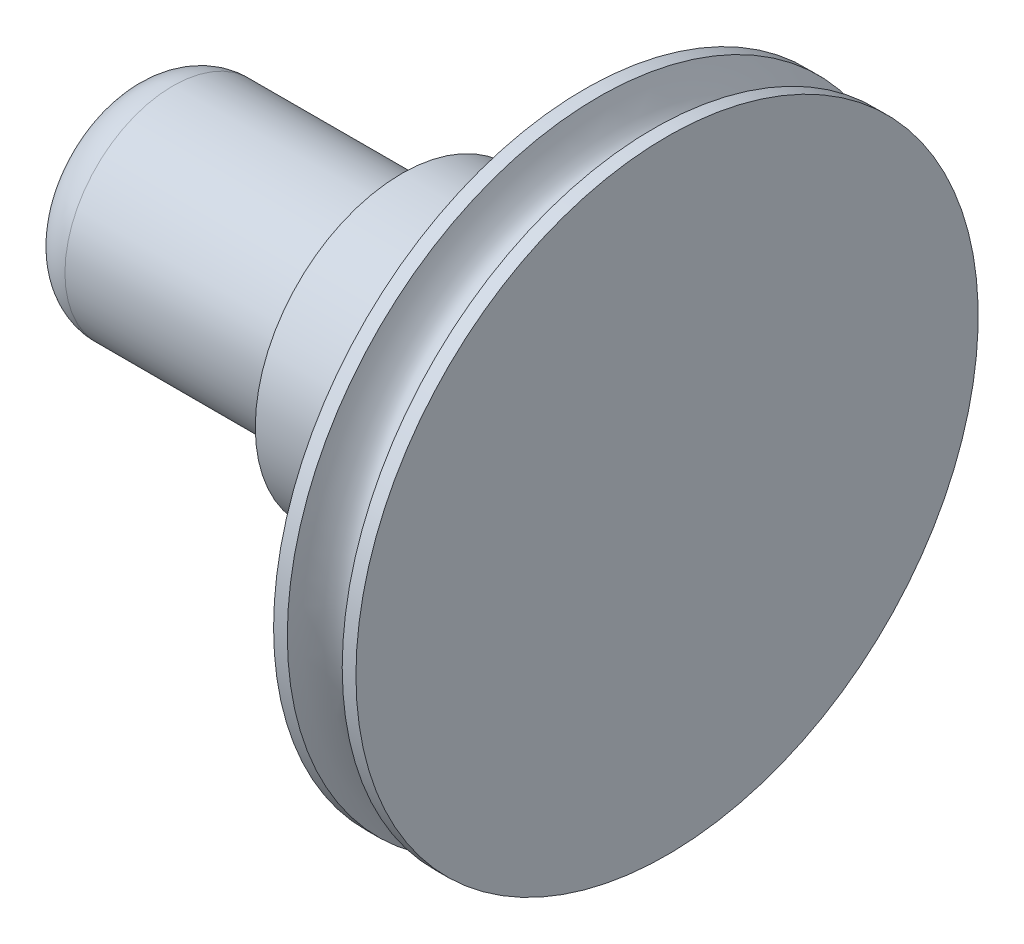
ISO-10303-21;
HEADER;
FILE_DESCRIPTION(('STEP AP214'),'2;1');
FILE_NAME('part.step','',(''),(''),'','','');
FILE_SCHEMA(('AUTOMOTIVE_DESIGN { 1 0 10303 214 1 1 1 1 }'));
ENDSEC;
DATA;
#1=APPLICATION_CONTEXT('core data for automotive mechanical design processes');
#2=APPLICATION_PROTOCOL_DEFINITION('international standard','automotive_design',2000,#1);
#3=PRODUCT_CONTEXT('',#1,'mechanical');
#4=PRODUCT('Part','Part','',(#3));
#5=PRODUCT_RELATED_PRODUCT_CATEGORY('part','',(#4));
#6=PRODUCT_DEFINITION_FORMATION('','',#4);
#7=PRODUCT_DEFINITION_CONTEXT('part definition',#1,'design');
#8=PRODUCT_DEFINITION('design','',#6,#7);
#9=PRODUCT_DEFINITION_SHAPE('','',#8);
#10=(LENGTH_UNIT() NAMED_UNIT(*) SI_UNIT(.MILLI.,.METRE.));
#11=(NAMED_UNIT(*) PLANE_ANGLE_UNIT() SI_UNIT($,.RADIAN.));
#12=(NAMED_UNIT(*) SI_UNIT($,.STERADIAN.) SOLID_ANGLE_UNIT());
#13=UNCERTAINTY_MEASURE_WITH_UNIT(LENGTH_MEASURE(1.E-05),#10,'distance_accuracy_value','');
#14=(GEOMETRIC_REPRESENTATION_CONTEXT(3) GLOBAL_UNCERTAINTY_ASSIGNED_CONTEXT((#13)) GLOBAL_UNIT_ASSIGNED_CONTEXT((#10,
#11,#12)) REPRESENTATION_CONTEXT('',''));
#15=CARTESIAN_POINT('',(0.,0.,0.));
#16=DIRECTION('',(0.,0.,1.));
#17=DIRECTION('',(1.,0.,0.));
#18=AXIS2_PLACEMENT_3D('',#15,#16,#17);
#19=CARTESIAN_POINT('',(3.75,0.,-17.));
#20=CARTESIAN_POINT('',(2.31401842890253,0.,-12.9994242119702));
#21=CARTESIAN_POINT('',(0.75,0.,-17.));
#22=B_SPLINE_CURVE_WITH_KNOTS('',2,(#19,#20,#21),.UNSPECIFIED.,.F.,.F.,(3,3),(0.,1.),.UNSPECIFIED.);
#23=CARTESIAN_POINT('',(0.,0.,0.));
#24=DIRECTION('',(-1.,0.,0.));
#25=AXIS1_PLACEMENT('',#23,#24);
#26=SURFACE_OF_REVOLUTION('',#22,#25);
#27=CARTESIAN_POINT('',(0.749999999999999,0.,0.));
#28=DIRECTION('',(-1.,0.,0.));
#29=DIRECTION('',(0.,0.,1.));
#30=AXIS2_PLACEMENT_3D('',#27,#28,#29);
#31=CIRCLE('',#30,17.);
#32=CARTESIAN_POINT('',(0.749999999999997,0.,17.));
#33=VERTEX_POINT('',#32);
#34=EDGE_CURVE('E57',#33,#33,#31,.T.);
#35=ORIENTED_EDGE('',*,*,#34,.F.);
#36=EDGE_LOOP('',(#35));
#37=FACE_BOUND('',#36,.T.);
#38=CARTESIAN_POINT('',(3.75,0.,0.));
#39=DIRECTION('',(-1.,0.,0.));
#40=DIRECTION('',(0.,0.,1.));
#41=AXIS2_PLACEMENT_3D('',#38,#39,#40);
#42=CIRCLE('',#41,17.);
#43=CARTESIAN_POINT('',(3.75,0.,17.));
#44=VERTEX_POINT('',#43);
#45=EDGE_CURVE('E46',#44,#44,#42,.T.);
#46=ORIENTED_EDGE('',*,*,#45,.T.);
#47=EDGE_LOOP('',(#46));
#48=FACE_BOUND('',#47,.T.);
#49=ADVANCED_FACE('F31',(#37,#48),#26,.T.);
#50=CARTESIAN_POINT('',(0.,0.,0.));
#51=DIRECTION('',(-1.,0.,0.));
#52=DIRECTION('',(0.,0.,1.));
#53=AXIS2_PLACEMENT_3D('',#50,#51,#52);
#54=CYLINDRICAL_SURFACE('',#53,17.);
#55=ORIENTED_EDGE('',*,*,#45,.F.);
#56=EDGE_LOOP('',(#55));
#57=FACE_BOUND('',#56,.T.);
#58=CARTESIAN_POINT('',(4.5,0.,0.));
#59=DIRECTION('',(-1.,0.,0.));
#60=DIRECTION('',(0.,0.,1.));
#61=AXIS2_PLACEMENT_3D('',#58,#59,#60);
#62=CIRCLE('',#61,17.);
#63=CARTESIAN_POINT('',(4.5,0.,17.));
#64=VERTEX_POINT('',#63);
#65=EDGE_CURVE('E51',#64,#64,#62,.T.);
#66=ORIENTED_EDGE('',*,*,#65,.T.);
#67=EDGE_LOOP('',(#66));
#68=FACE_BOUND('',#67,.T.);
#69=ADVANCED_FACE('F71',(#57,#68),#54,.T.);
#70=CARTESIAN_POINT('',(4.5,0.,-17.));
#71=DIRECTION('',(-1.,0.,0.));
#72=DIRECTION('',(0.,0.,1.));
#73=AXIS2_PLACEMENT_3D('',#70,#71,#72);
#74=PLANE('',#73);
#75=ORIENTED_EDGE('',*,*,#65,.F.);
#76=EDGE_LOOP('',(#75));
#77=FACE_BOUND('',#76,.T.);
#78=ADVANCED_FACE('F75',(#77),#74,.F.);
#79=CARTESIAN_POINT('',(0.,0.,0.));
#80=DIRECTION('',(1.,0.,0.));
#81=DIRECTION('',(0.,0.,-1.));
#82=AXIS2_PLACEMENT_3D('',#79,#80,#81);
#83=PLANE('',#82);
#84=CARTESIAN_POINT('',(0.,0.,0.));
#85=DIRECTION('',(1.,0.,0.));
#86=DIRECTION('',(0.,0.,-1.));
#87=AXIS2_PLACEMENT_3D('',#84,#85,#86);
#88=CIRCLE('',#87,8.);
#89=CARTESIAN_POINT('',(0.,0.,-8.));
#90=VERTEX_POINT('',#89);
#91=EDGE_CURVE('E42',#90,#90,#88,.F.);
#92=ORIENTED_EDGE('',*,*,#91,.F.);
#93=EDGE_LOOP('',(#92));
#94=FACE_BOUND('',#93,.T.);
#95=CARTESIAN_POINT('',(0.,0.,0.));
#96=DIRECTION('',(-1.,0.,0.));
#97=DIRECTION('',(0.,0.,1.));
#98=AXIS2_PLACEMENT_3D('',#95,#96,#97);
#99=CIRCLE('',#98,17.);
#100=CARTESIAN_POINT('',(0.,0.,17.));
#101=VERTEX_POINT('',#100);
#102=EDGE_CURVE('E54',#101,#101,#99,.T.);
#103=ORIENTED_EDGE('',*,*,#102,.T.);
#104=EDGE_LOOP('',(#103));
#105=FACE_BOUND('',#104,.T.);
#106=ADVANCED_FACE('F79',(#94,#105),#83,.F.);
#107=CARTESIAN_POINT('',(0.,0.,0.));
#108=DIRECTION('',(-1.,0.,0.));
#109=DIRECTION('',(0.,0.,1.));
#110=AXIS2_PLACEMENT_3D('',#107,#108,#109);
#111=CYLINDRICAL_SURFACE('',#110,17.);
#112=ORIENTED_EDGE('',*,*,#102,.F.);
#113=EDGE_LOOP('',(#112));
#114=FACE_BOUND('',#113,.T.);
#115=ORIENTED_EDGE('',*,*,#34,.T.);
#116=EDGE_LOOP('',(#115));
#117=FACE_BOUND('',#116,.T.);
#118=ADVANCED_FACE('F83',(#114,#117),#111,.T.);
#119=CARTESIAN_POINT('',(-25.,0.,0.));
#120=DIRECTION('',(-1.,0.,0.));
#121=DIRECTION('',(0.,0.,1.));
#122=AXIS2_PLACEMENT_3D('',#119,#120,#121);
#123=CYLINDRICAL_SURFACE('',#122,8.);
#124=CARTESIAN_POINT('',(-10.,0.,0.));
#125=DIRECTION('',(-1.,0.,0.));
#126=DIRECTION('',(0.,0.,1.));
#127=AXIS2_PLACEMENT_3D('',#124,#125,#126);
#128=CIRCLE('',#127,8.);
#129=CARTESIAN_POINT('',(-10.,0.,8.));
#130=VERTEX_POINT('',#129);
#131=EDGE_CURVE('E60',#130,#130,#128,.T.);
#132=ORIENTED_EDGE('',*,*,#131,.F.);
#133=EDGE_LOOP('',(#132));
#134=FACE_BOUND('',#133,.T.);
#135=ORIENTED_EDGE('',*,*,#91,.T.);
#136=EDGE_LOOP('',(#135));
#137=FACE_BOUND('',#136,.T.);
#138=ADVANCED_FACE('F87',(#134,#137),#123,.T.);
#139=CARTESIAN_POINT('',(-10.,0.,-8.));
#140=DIRECTION('',(1.,0.,0.));
#141=DIRECTION('',(0.,0.,-1.));
#142=AXIS2_PLACEMENT_3D('',#139,#140,#141);
#143=PLANE('',#142);
#144=CARTESIAN_POINT('',(-10.,0.,0.));
#145=DIRECTION('',(-1.,0.,0.));
#146=DIRECTION('',(0.,0.,1.));
#147=AXIS2_PLACEMENT_3D('',#144,#145,#146);
#148=CIRCLE('',#147,5.9);
#149=CARTESIAN_POINT('',(-10.,0.,5.9));
#150=VERTEX_POINT('',#149);
#151=EDGE_CURVE('E170',#150,#150,#148,.T.);
#152=ORIENTED_EDGE('',*,*,#151,.F.);
#153=EDGE_LOOP('',(#152));
#154=FACE_BOUND('',#153,.T.);
#155=ORIENTED_EDGE('',*,*,#131,.T.);
#156=EDGE_LOOP('',(#155));
#157=FACE_BOUND('',#156,.T.);
#158=ADVANCED_FACE('F91',(#154,#157),#143,.F.);
#159=CARTESIAN_POINT('',(-25.,0.,0.));
#160=DIRECTION('',(-1.,0.,0.));
#161=DIRECTION('',(0.,0.,1.));
#162=AXIS2_PLACEMENT_3D('',#159,#160,#161);
#163=CYLINDRICAL_SURFACE('',#162,5.9);
#164=CARTESIAN_POINT('',(-22.5,0.,0.));
#165=DIRECTION('',(1.,0.,0.));
#166=DIRECTION('',(0.,0.,-1.));
#167=AXIS2_PLACEMENT_3D('',#164,#165,#166);
#168=CIRCLE('',#167,5.9);
#169=CARTESIAN_POINT('',(-22.5,0.,-5.9));
#170=VERTEX_POINT('',#169);
#171=EDGE_CURVE('E10',#170,#170,#168,.T.);
#172=ORIENTED_EDGE('',*,*,#171,.T.);
#173=EDGE_LOOP('',(#172));
#174=FACE_BOUND('',#173,.T.);
#175=ORIENTED_EDGE('',*,*,#151,.T.);
#176=EDGE_LOOP('',(#175));
#177=FACE_BOUND('',#176,.T.);
#178=ADVANCED_FACE('F95',(#174,#177),#163,.T.);
#179=CARTESIAN_POINT('',(-25.,0.,-5.9));
#180=DIRECTION('',(1.,0.,0.));
#181=DIRECTION('',(0.,0.,-1.));
#182=AXIS2_PLACEMENT_3D('',#179,#180,#181);
#183=PLANE('',#182);
#184=CARTESIAN_POINT('',(-25.,0.,0.));
#185=DIRECTION('',(1.,0.,0.));
#186=DIRECTION('',(0.,0.,-1.));
#187=AXIS2_PLACEMENT_3D('',#184,#185,#186);
#188=CIRCLE('',#187,3.4);
#189=CARTESIAN_POINT('',(-25.,0.,-3.4));
#190=VERTEX_POINT('',#189);
#191=EDGE_CURVE('E38',#190,#190,#188,.F.);
#192=ORIENTED_EDGE('',*,*,#191,.T.);
#193=EDGE_LOOP('',(#192));
#194=FACE_BOUND('',#193,.T.);
#195=ADVANCED_FACE('F99',(#194),#183,.F.);
#196=CARTESIAN_POINT('',(-22.5,0.,0.));
#197=DIRECTION('',(1.,0.,0.));
#198=DIRECTION('',(0.,0.,-1.));
#199=AXIS2_PLACEMENT_3D('',#196,#197,#198);
#200=TOROIDAL_SURFACE('',#199,3.4,2.5);
#201=ORIENTED_EDGE('',*,*,#171,.F.);
#202=EDGE_LOOP('',(#201));
#203=FACE_BOUND('',#202,.T.);
#204=ORIENTED_EDGE('',*,*,#191,.F.);
#205=EDGE_LOOP('',(#204));
#206=FACE_BOUND('',#205,.T.);
#207=ADVANCED_FACE('F33',(#203,#206),#200,.T.);
#208=CLOSED_SHELL('',(#49,#69,#78,#106,#118,#138,#158,#178,#195,#207));
#209=MANIFOLD_SOLID_BREP('B2',#208);
#210=ADVANCED_BREP_SHAPE_REPRESENTATION('',(#18,#209),#14);
#211=SHAPE_DEFINITION_REPRESENTATION(#9,#210);
ENDSEC;
END-ISO-10303-21;
